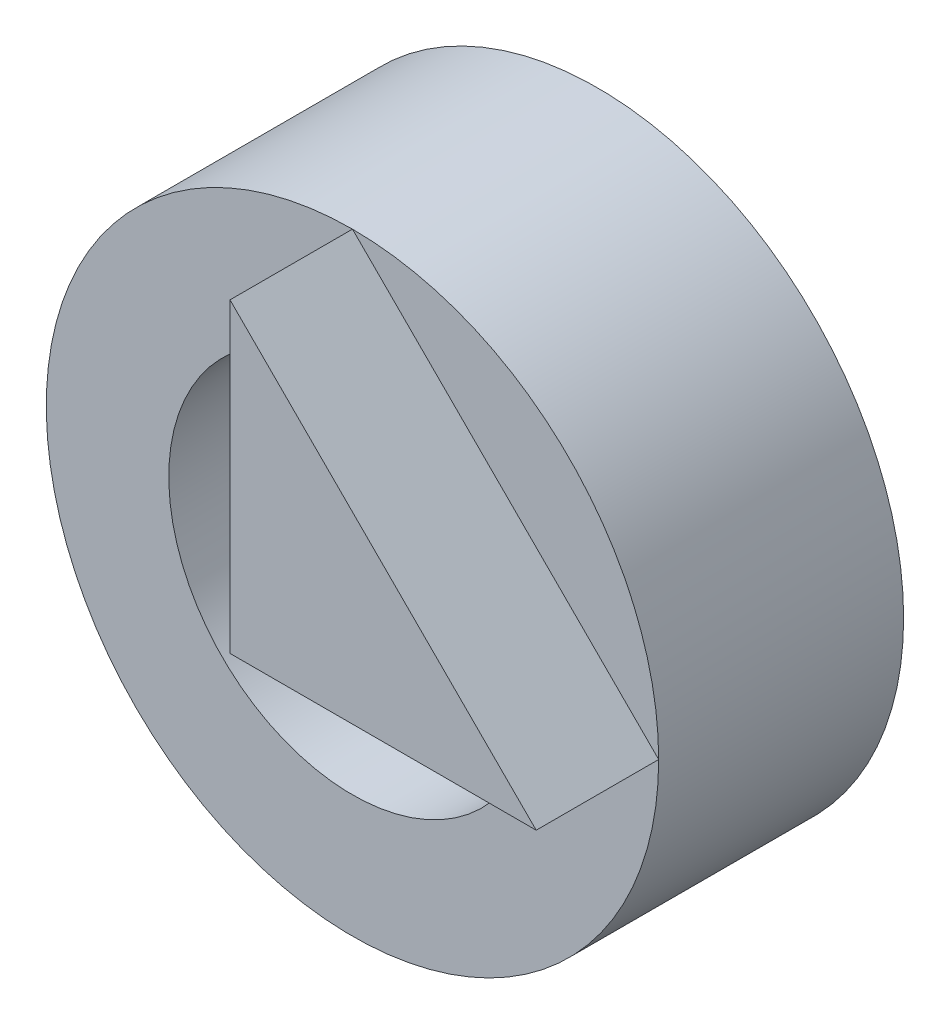
ISO-10303-21;
HEADER;
FILE_DESCRIPTION(('STEP AP214'),'2;1');
FILE_NAME('part.step','',(''),(''),'','','');
FILE_SCHEMA(('AUTOMOTIVE_DESIGN { 1 0 10303 214 1 1 1 1 }'));
ENDSEC;
DATA;
#1=APPLICATION_CONTEXT('core data for automotive mechanical design processes');
#2=APPLICATION_PROTOCOL_DEFINITION('international standard','automotive_design',2000,#1);
#3=PRODUCT_CONTEXT('',#1,'mechanical');
#4=PRODUCT('Part','Part','',(#3));
#5=PRODUCT_RELATED_PRODUCT_CATEGORY('part','',(#4));
#6=PRODUCT_DEFINITION_FORMATION('','',#4);
#7=PRODUCT_DEFINITION_CONTEXT('part definition',#1,'design');
#8=PRODUCT_DEFINITION('design','',#6,#7);
#9=PRODUCT_DEFINITION_SHAPE('','',#8);
#10=(LENGTH_UNIT() NAMED_UNIT(*) SI_UNIT(.MILLI.,.METRE.));
#11=(NAMED_UNIT(*) PLANE_ANGLE_UNIT() SI_UNIT($,.RADIAN.));
#12=(NAMED_UNIT(*) SI_UNIT($,.STERADIAN.) SOLID_ANGLE_UNIT());
#13=UNCERTAINTY_MEASURE_WITH_UNIT(LENGTH_MEASURE(1.E-05),#10,'distance_accuracy_value','');
#14=(GEOMETRIC_REPRESENTATION_CONTEXT(3) GLOBAL_UNCERTAINTY_ASSIGNED_CONTEXT((#13)) GLOBAL_UNIT_ASSIGNED_CONTEXT((#10,
#11,#12)) REPRESENTATION_CONTEXT('',''));
#15=CARTESIAN_POINT('',(0.,0.,0.));
#16=DIRECTION('',(0.,0.,1.));
#17=DIRECTION('',(1.,0.,0.));
#18=AXIS2_PLACEMENT_3D('',#15,#16,#17);
#19=CARTESIAN_POINT('',(0.,0.,2.));
#20=DIRECTION('',(0.,0.,1.));
#21=DIRECTION('',(1.,0.,0.));
#22=AXIS2_PLACEMENT_3D('',#19,#20,#21);
#23=PLANE('',#22);
#24=DIRECTION('',(1.,0.,0.));
#25=VECTOR('',#24,1.);
#26=CARTESIAN_POINT('',(2.5,0.,2.));
#27=LINE('',#26,#25);
#28=CARTESIAN_POINT('',(1.5,0.,2.));
#29=VERTEX_POINT('',#28);
#30=CARTESIAN_POINT('',(2.5,0.,2.));
#31=VERTEX_POINT('',#30);
#32=EDGE_CURVE('E11',#29,#31,#27,.T.);
#33=ORIENTED_EDGE('',*,*,#32,.F.);
#34=CARTESIAN_POINT('',(0.,0.,2.));
#35=DIRECTION('',(0.,0.,1.));
#36=DIRECTION('',(1.,0.,0.));
#37=AXIS2_PLACEMENT_3D('',#34,#35,#36);
#38=CIRCLE('',#37,1.5);
#39=CARTESIAN_POINT('',(0.,1.5,2.));
#40=VERTEX_POINT('',#39);
#41=EDGE_CURVE('E56',#40,#29,#38,.T.);
#42=ORIENTED_EDGE('',*,*,#41,.F.);
#43=DIRECTION('',(0.,-1.,0.));
#44=VECTOR('',#43,1.);
#45=CARTESIAN_POINT('',(0.,0.,2.));
#46=LINE('',#45,#44);
#47=CARTESIAN_POINT('',(0.,2.5,2.));
#48=VERTEX_POINT('',#47);
#49=EDGE_CURVE('E98',#48,#40,#46,.T.);
#50=ORIENTED_EDGE('',*,*,#49,.F.);
#51=CARTESIAN_POINT('',(0.,0.,2.));
#52=DIRECTION('',(0.,0.,1.));
#53=DIRECTION('',(1.,0.,0.));
#54=AXIS2_PLACEMENT_3D('',#51,#52,#53);
#55=CIRCLE('',#54,2.5);
#56=EDGE_CURVE('E111',#48,#31,#55,.T.);
#57=ORIENTED_EDGE('',*,*,#56,.T.);
#58=EDGE_LOOP('',(#33,#42,#50,#57));
#59=FACE_BOUND('',#58,.T.);
#60=ADVANCED_FACE('F38',(#59),#23,.T.);
#61=DIRECTION('',(-0.707106781186548,0.707106781186548,0.));
#62=VECTOR('',#61,1.);
#63=CARTESIAN_POINT('',(0.,2.5,2.));
#64=LINE('',#63,#62);
#65=EDGE_CURVE('E145',#31,#48,#64,.T.);
#66=ORIENTED_EDGE('',*,*,#65,.F.);
#67=EDGE_CURVE('E47',#31,#48,#55,.T.);
#68=ORIENTED_EDGE('',*,*,#67,.T.);
#69=EDGE_LOOP('',(#66,#68));
#70=FACE_BOUND('',#69,.T.);
#71=ADVANCED_FACE('F122',(#70),#23,.T.);
#72=CARTESIAN_POINT('',(0.,0.,0.));
#73=DIRECTION('',(0.,0.,1.));
#74=DIRECTION('',(1.,0.,0.));
#75=AXIS2_PLACEMENT_3D('',#72,#73,#74);
#76=PLANE('',#75);
#77=CARTESIAN_POINT('',(0.,0.,0.));
#78=DIRECTION('',(0.,0.,1.));
#79=DIRECTION('',(1.,0.,0.));
#80=AXIS2_PLACEMENT_3D('',#77,#78,#79);
#81=CIRCLE('',#80,2.5);
#82=CARTESIAN_POINT('',(2.5,0.,0.));
#83=VERTEX_POINT('',#82);
#84=EDGE_CURVE('E42',#83,#83,#81,.T.);
#85=ORIENTED_EDGE('',*,*,#84,.F.);
#86=EDGE_LOOP('',(#85));
#87=FACE_BOUND('',#86,.T.);
#88=CARTESIAN_POINT('',(0.,0.,0.));
#89=DIRECTION('',(0.,0.,1.));
#90=DIRECTION('',(1.,0.,0.));
#91=AXIS2_PLACEMENT_3D('',#88,#89,#90);
#92=CIRCLE('',#91,1.5);
#93=CARTESIAN_POINT('',(1.5,0.,0.));
#94=VERTEX_POINT('',#93);
#95=EDGE_CURVE('E102',#94,#94,#92,.T.);
#96=ORIENTED_EDGE('',*,*,#95,.T.);
#97=EDGE_LOOP('',(#96));
#98=FACE_BOUND('',#97,.T.);
#99=ADVANCED_FACE('F119',(#87,#98),#76,.F.);
#100=CARTESIAN_POINT('',(0.,0.,2.));
#101=DIRECTION('',(0.,0.,-1.));
#102=DIRECTION('',(-1.,0.,0.));
#103=AXIS2_PLACEMENT_3D('',#100,#101,#102);
#104=CYLINDRICAL_SURFACE('',#103,2.5);
#105=ORIENTED_EDGE('',*,*,#67,.F.);
#106=ORIENTED_EDGE('',*,*,#56,.F.);
#107=EDGE_LOOP('',(#105,#106));
#108=FACE_BOUND('',#107,.T.);
#109=ORIENTED_EDGE('',*,*,#84,.T.);
#110=EDGE_LOOP('',(#109));
#111=FACE_BOUND('',#110,.T.);
#112=ADVANCED_FACE('F40',(#108,#111),#104,.T.);
#113=CARTESIAN_POINT('',(0.,0.,2.));
#114=DIRECTION('',(0.,0.,-1.));
#115=DIRECTION('',(-1.,0.,0.));
#116=AXIS2_PLACEMENT_3D('',#113,#114,#115);
#117=CYLINDRICAL_SURFACE('',#116,1.5);
#118=EDGE_CURVE('E110',#29,#40,#38,.T.);
#119=ORIENTED_EDGE('',*,*,#118,.T.);
#120=ORIENTED_EDGE('',*,*,#41,.T.);
#121=EDGE_LOOP('',(#119,#120));
#122=FACE_BOUND('',#121,.T.);
#123=ORIENTED_EDGE('',*,*,#95,.F.);
#124=EDGE_LOOP('',(#123));
#125=FACE_BOUND('',#124,.T.);
#126=ADVANCED_FACE('F125',(#122,#125),#117,.F.);
#127=CARTESIAN_POINT('',(0.,0.,2.));
#128=DIRECTION('',(0.,0.,-1.));
#129=DIRECTION('',(-1.,0.,0.));
#130=AXIS2_PLACEMENT_3D('',#127,#128,#129);
#131=PLANE('',#130);
#132=ORIENTED_EDGE('',*,*,#118,.F.);
#133=CARTESIAN_POINT('',(0.,0.,2.));
#134=VERTEX_POINT('',#133);
#135=EDGE_CURVE('E49',#134,#29,#27,.T.);
#136=ORIENTED_EDGE('',*,*,#135,.F.);
#137=EDGE_CURVE('E146',#40,#134,#46,.T.);
#138=ORIENTED_EDGE('',*,*,#137,.F.);
#139=EDGE_LOOP('',(#132,#136,#138));
#140=FACE_BOUND('',#139,.T.);
#141=ADVANCED_FACE('F127',(#140),#131,.T.);
#142=CARTESIAN_POINT('',(2.5,0.,3.));
#143=DIRECTION('',(0.,1.,0.));
#144=DIRECTION('',(0.,0.,1.));
#145=AXIS2_PLACEMENT_3D('',#142,#143,#144);
#146=PLANE('',#145);
#147=ORIENTED_EDGE('',*,*,#135,.T.);
#148=ORIENTED_EDGE('',*,*,#32,.T.);
#149=DIRECTION('',(0.,0.,-1.));
#150=VECTOR('',#149,1.);
#151=CARTESIAN_POINT('',(2.5,0.,3.));
#152=LINE('',#151,#150);
#153=CARTESIAN_POINT('',(2.5,0.,3.));
#154=VERTEX_POINT('',#153);
#155=EDGE_CURVE('E85',#154,#31,#152,.T.);
#156=ORIENTED_EDGE('',*,*,#155,.F.);
#157=DIRECTION('',(1.,0.,0.));
#158=VECTOR('',#157,1.);
#159=CARTESIAN_POINT('',(2.5,0.,3.));
#160=LINE('',#159,#158);
#161=CARTESIAN_POINT('',(0.,0.,3.));
#162=VERTEX_POINT('',#161);
#163=EDGE_CURVE('E91',#162,#154,#160,.T.);
#164=ORIENTED_EDGE('',*,*,#163,.F.);
#165=DIRECTION('',(0.,0.,-1.));
#166=VECTOR('',#165,1.);
#167=CARTESIAN_POINT('',(0.,0.,3.));
#168=LINE('',#167,#166);
#169=EDGE_CURVE('E106',#162,#134,#168,.T.);
#170=ORIENTED_EDGE('',*,*,#169,.T.);
#171=EDGE_LOOP('',(#147,#148,#156,#164,#170));
#172=FACE_BOUND('',#171,.T.);
#173=ADVANCED_FACE('F101',(#172),#146,.F.);
#174=CARTESIAN_POINT('',(0.,2.5,3.));
#175=DIRECTION('',(-0.707106781186547,-0.707106781186547,0.));
#176=DIRECTION('',(0.707106781186548,-0.707106781186548,0.));
#177=AXIS2_PLACEMENT_3D('',#174,#175,#176);
#178=PLANE('',#177);
#179=ORIENTED_EDGE('',*,*,#65,.T.);
#180=DIRECTION('',(0.,0.,-1.));
#181=VECTOR('',#180,1.);
#182=CARTESIAN_POINT('',(0.,2.5,3.));
#183=LINE('',#182,#181);
#184=CARTESIAN_POINT('',(0.,2.5,3.));
#185=VERTEX_POINT('',#184);
#186=EDGE_CURVE('E87',#185,#48,#183,.T.);
#187=ORIENTED_EDGE('',*,*,#186,.F.);
#188=DIRECTION('',(-0.707106781186548,0.707106781186548,0.));
#189=VECTOR('',#188,1.);
#190=CARTESIAN_POINT('',(0.,2.5,3.));
#191=LINE('',#190,#189);
#192=EDGE_CURVE('E80',#154,#185,#191,.T.);
#193=ORIENTED_EDGE('',*,*,#192,.F.);
#194=ORIENTED_EDGE('',*,*,#155,.T.);
#195=EDGE_LOOP('',(#179,#187,#193,#194));
#196=FACE_BOUND('',#195,.T.);
#197=ADVANCED_FACE('F83',(#196),#178,.F.);
#198=CARTESIAN_POINT('',(0.,0.,3.));
#199=DIRECTION('',(1.,0.,0.));
#200=DIRECTION('',(0.,0.,-1.));
#201=AXIS2_PLACEMENT_3D('',#198,#199,#200);
#202=PLANE('',#201);
#203=ORIENTED_EDGE('',*,*,#49,.T.);
#204=ORIENTED_EDGE('',*,*,#137,.T.);
#205=ORIENTED_EDGE('',*,*,#169,.F.);
#206=DIRECTION('',(0.,-1.,0.));
#207=VECTOR('',#206,1.);
#208=CARTESIAN_POINT('',(0.,0.,3.));
#209=LINE('',#208,#207);
#210=EDGE_CURVE('E90',#185,#162,#209,.T.);
#211=ORIENTED_EDGE('',*,*,#210,.F.);
#212=ORIENTED_EDGE('',*,*,#186,.T.);
#213=EDGE_LOOP('',(#203,#204,#205,#211,#212));
#214=FACE_BOUND('',#213,.T.);
#215=ADVANCED_FACE('F155',(#214),#202,.F.);
#216=CARTESIAN_POINT('',(0.,0.,3.));
#217=DIRECTION('',(0.,0.,-1.));
#218=DIRECTION('',(-1.,0.,0.));
#219=AXIS2_PLACEMENT_3D('',#216,#217,#218);
#220=PLANE('',#219);
#221=ORIENTED_EDGE('',*,*,#163,.T.);
#222=ORIENTED_EDGE('',*,*,#192,.T.);
#223=ORIENTED_EDGE('',*,*,#210,.T.);
#224=EDGE_LOOP('',(#221,#222,#223));
#225=FACE_BOUND('',#224,.T.);
#226=ADVANCED_FACE('F94',(#225),#220,.F.);
#227=CLOSED_SHELL('',(#60,#71,#99,#112,#126,#141,#173,#197,#215,#226));
#228=MANIFOLD_SOLID_BREP('B2',#227);
#229=ADVANCED_BREP_SHAPE_REPRESENTATION('',(#18,#228),#14);
#230=SHAPE_DEFINITION_REPRESENTATION(#9,#229);
ENDSEC;
END-ISO-10303-21;
